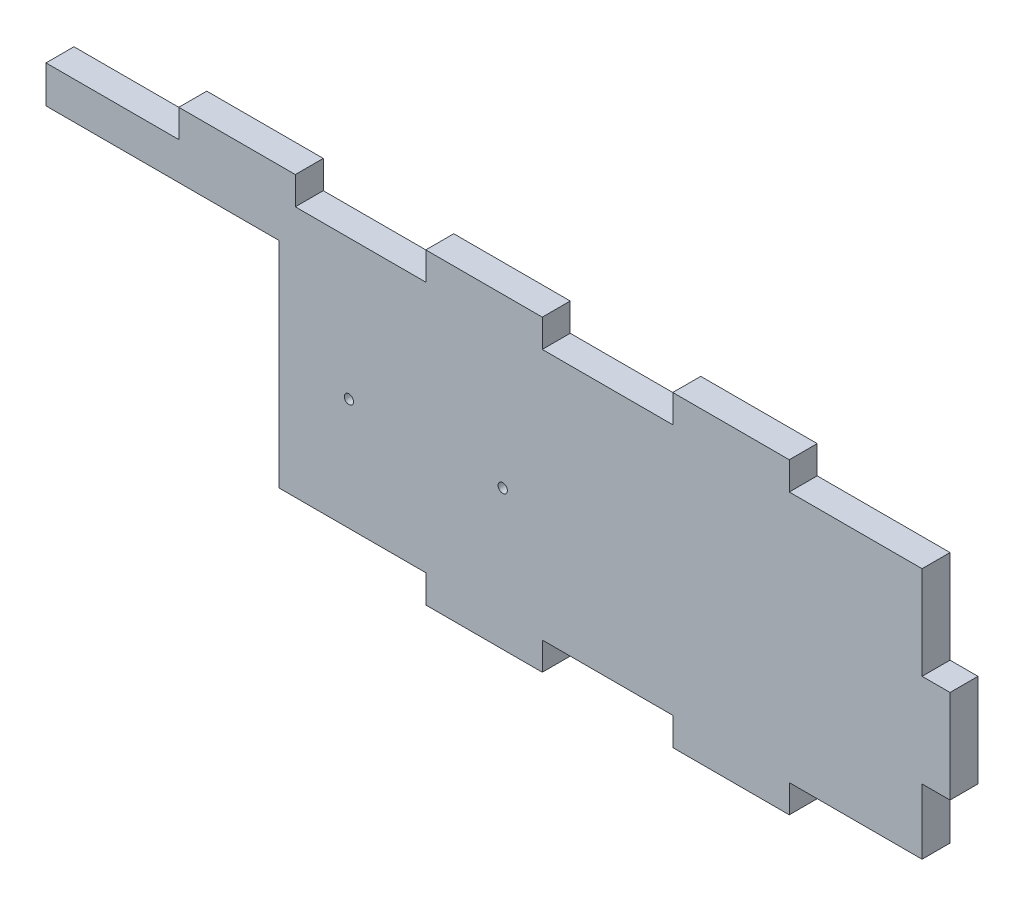
ISO-10303-21;
HEADER;
FILE_DESCRIPTION(('STEP AP214'),'2;1');
FILE_NAME('part.step','',(''),(''),'','','');
FILE_SCHEMA(('AUTOMOTIVE_DESIGN { 1 0 10303 214 1 1 1 1 }'));
ENDSEC;
DATA;
#1=APPLICATION_CONTEXT('core data for automotive mechanical design processes');
#2=APPLICATION_PROTOCOL_DEFINITION('international standard','automotive_design',2000,#1);
#3=PRODUCT_CONTEXT('',#1,'mechanical');
#4=PRODUCT('Part','Part','',(#3));
#5=PRODUCT_RELATED_PRODUCT_CATEGORY('part','',(#4));
#6=PRODUCT_DEFINITION_FORMATION('','',#4);
#7=PRODUCT_DEFINITION_CONTEXT('part definition',#1,'design');
#8=PRODUCT_DEFINITION('design','',#6,#7);
#9=PRODUCT_DEFINITION_SHAPE('','',#8);
#10=(LENGTH_UNIT() NAMED_UNIT(*) SI_UNIT(.MILLI.,.METRE.));
#11=(NAMED_UNIT(*) PLANE_ANGLE_UNIT() SI_UNIT($,.RADIAN.));
#12=(NAMED_UNIT(*) SI_UNIT($,.STERADIAN.) SOLID_ANGLE_UNIT());
#13=UNCERTAINTY_MEASURE_WITH_UNIT(LENGTH_MEASURE(1.E-05),#10,'distance_accuracy_value','');
#14=(GEOMETRIC_REPRESENTATION_CONTEXT(3) GLOBAL_UNCERTAINTY_ASSIGNED_CONTEXT((#13)) GLOBAL_UNIT_ASSIGNED_CONTEXT((#10,
#11,#12)) REPRESENTATION_CONTEXT('',''));
#15=CARTESIAN_POINT('',(0.,0.,0.));
#16=DIRECTION('',(0.,0.,1.));
#17=DIRECTION('',(1.,0.,0.));
#18=AXIS2_PLACEMENT_3D('',#15,#16,#17);
#19=CARTESIAN_POINT('',(94.,-30.,6.));
#20=DIRECTION('',(0.,1.,0.));
#21=DIRECTION('',(-1.,0.,0.));
#22=AXIS2_PLACEMENT_3D('',#19,#20,#21);
#23=PLANE('',#22);
#24=DIRECTION('',(1.,0.,0.));
#25=VECTOR('',#24,1.);
#26=CARTESIAN_POINT('',(94.,-30.,6.));
#27=LINE('',#26,#25);
#28=CARTESIAN_POINT('',(40.5,-30.,6.));
#29=VERTEX_POINT('',#28);
#30=CARTESIAN_POINT('',(65.5,-30.,6.));
#31=VERTEX_POINT('',#30);
#32=EDGE_CURVE('E504',#29,#31,#27,.T.);
#33=ORIENTED_EDGE('',*,*,#32,.F.);
#34=DIRECTION('',(0.,0.,-1.));
#35=VECTOR('',#34,1.);
#36=CARTESIAN_POINT('',(40.5,-30.,10.));
#37=LINE('',#36,#35);
#38=CARTESIAN_POINT('',(40.5,-30.,0.));
#39=VERTEX_POINT('',#38);
#40=EDGE_CURVE('E522',#29,#39,#37,.T.);
#41=ORIENTED_EDGE('',*,*,#40,.T.);
#42=DIRECTION('',(1.,0.,0.));
#43=VECTOR('',#42,1.);
#44=CARTESIAN_POINT('',(94.,-30.,0.));
#45=LINE('',#44,#43);
#46=CARTESIAN_POINT('',(65.5,-30.,0.));
#47=VERTEX_POINT('',#46);
#48=EDGE_CURVE('E250',#39,#47,#45,.T.);
#49=ORIENTED_EDGE('',*,*,#48,.T.);
#50=DIRECTION('',(0.,0.,-1.));
#51=VECTOR('',#50,1.);
#52=CARTESIAN_POINT('',(65.5,-30.,10.));
#53=LINE('',#52,#51);
#54=EDGE_CURVE('E382',#31,#47,#53,.T.);
#55=ORIENTED_EDGE('',*,*,#54,.F.);
#56=EDGE_LOOP('',(#33,#41,#49,#55));
#57=FACE_BOUND('',#56,.T.);
#58=ADVANCED_FACE('F32',(#57),#23,.F.);
#59=CARTESIAN_POINT('',(94.,30.,6.));
#60=DIRECTION('',(0.,-1.,0.));
#61=DIRECTION('',(1.,0.,0.));
#62=AXIS2_PLACEMENT_3D('',#59,#60,#61);
#63=PLANE('',#62);
#64=DIRECTION('',(0.,0.,-1.));
#65=VECTOR('',#64,1.);
#66=CARTESIAN_POINT('',(-40.5,30.,0.));
#67=LINE('',#66,#65);
#68=CARTESIAN_POINT('',(-40.5,30.,6.));
#69=VERTEX_POINT('',#68);
#70=CARTESIAN_POINT('',(-40.5,30.,0.));
#71=VERTEX_POINT('',#70);
#72=EDGE_CURVE('E403',#69,#71,#67,.T.);
#73=ORIENTED_EDGE('',*,*,#72,.F.);
#74=DIRECTION('',(-1.,0.,0.));
#75=VECTOR('',#74,1.);
#76=CARTESIAN_POINT('',(94.,30.,6.));
#77=LINE('',#76,#75);
#78=CARTESIAN_POINT('',(-12.5,30.,6.));
#79=VERTEX_POINT('',#78);
#80=EDGE_CURVE('E326',#79,#69,#77,.T.);
#81=ORIENTED_EDGE('',*,*,#80,.F.);
#82=DIRECTION('',(0.,0.,1.));
#83=VECTOR('',#82,1.);
#84=CARTESIAN_POINT('',(-12.5,30.,0.));
#85=LINE('',#84,#83);
#86=CARTESIAN_POINT('',(-12.5,30.,0.));
#87=VERTEX_POINT('',#86);
#88=EDGE_CURVE('E435',#87,#79,#85,.T.);
#89=ORIENTED_EDGE('',*,*,#88,.F.);
#90=DIRECTION('',(-1.,0.,0.));
#91=VECTOR('',#90,1.);
#92=CARTESIAN_POINT('',(94.,30.,0.));
#93=LINE('',#92,#91);
#94=EDGE_CURVE('E318',#87,#71,#93,.T.);
#95=ORIENTED_EDGE('',*,*,#94,.T.);
#96=EDGE_LOOP('',(#73,#81,#89,#95));
#97=FACE_BOUND('',#96,.T.);
#98=ADVANCED_FACE('F558',(#97),#63,.F.);
#99=DIRECTION('',(0.,0.,1.));
#100=VECTOR('',#99,1.);
#101=CARTESIAN_POINT('',(-65.5,30.,0.));
#102=LINE('',#101,#100);
#103=CARTESIAN_POINT('',(-65.5,30.,0.));
#104=VERTEX_POINT('',#103);
#105=CARTESIAN_POINT('',(-65.5,30.,6.));
#106=VERTEX_POINT('',#105);
#107=EDGE_CURVE('E408',#104,#106,#102,.T.);
#108=ORIENTED_EDGE('',*,*,#107,.F.);
#109=CARTESIAN_POINT('',(-94.,30.,0.));
#110=VERTEX_POINT('',#109);
#111=EDGE_CURVE('E267',#104,#110,#93,.T.);
#112=ORIENTED_EDGE('',*,*,#111,.T.);
#113=DIRECTION('',(0.,0.,-1.));
#114=VECTOR('',#113,1.);
#115=CARTESIAN_POINT('',(-94.,30.,6.));
#116=LINE('',#115,#114);
#117=CARTESIAN_POINT('',(-94.,30.,6.));
#118=VERTEX_POINT('',#117);
#119=EDGE_CURVE('E322',#118,#110,#116,.T.);
#120=ORIENTED_EDGE('',*,*,#119,.F.);
#121=EDGE_CURVE('E268',#106,#118,#77,.T.);
#122=ORIENTED_EDGE('',*,*,#121,.F.);
#123=EDGE_LOOP('',(#108,#112,#120,#122));
#124=FACE_BOUND('',#123,.T.);
#125=ADVANCED_FACE('F485',(#124),#63,.F.);
#126=DIRECTION('',(0.,0.,-1.));
#127=VECTOR('',#126,1.);
#128=CARTESIAN_POINT('',(12.5,30.,0.));
#129=LINE('',#128,#127);
#130=CARTESIAN_POINT('',(12.5,30.,6.));
#131=VERTEX_POINT('',#130);
#132=CARTESIAN_POINT('',(12.5,30.,0.));
#133=VERTEX_POINT('',#132);
#134=EDGE_CURVE('E430',#131,#133,#129,.T.);
#135=ORIENTED_EDGE('',*,*,#134,.F.);
#136=CARTESIAN_POINT('',(40.5,30.,6.));
#137=VERTEX_POINT('',#136);
#138=EDGE_CURVE('E323',#137,#131,#77,.T.);
#139=ORIENTED_EDGE('',*,*,#138,.F.);
#140=DIRECTION('',(0.,0.,1.));
#141=VECTOR('',#140,1.);
#142=CARTESIAN_POINT('',(40.5,30.,0.));
#143=LINE('',#142,#141);
#144=CARTESIAN_POINT('',(40.5,30.,0.));
#145=VERTEX_POINT('',#144);
#146=EDGE_CURVE('E327',#145,#137,#143,.T.);
#147=ORIENTED_EDGE('',*,*,#146,.F.);
#148=EDGE_CURVE('E316',#145,#133,#93,.T.);
#149=ORIENTED_EDGE('',*,*,#148,.T.);
#150=EDGE_LOOP('',(#135,#139,#147,#149));
#151=FACE_BOUND('',#150,.T.);
#152=ADVANCED_FACE('F582',(#151),#63,.F.);
#153=DIRECTION('',(0.,0.,-1.));
#154=VECTOR('',#153,1.);
#155=CARTESIAN_POINT('',(65.5,30.,0.));
#156=LINE('',#155,#154);
#157=CARTESIAN_POINT('',(65.5,30.,6.));
#158=VERTEX_POINT('',#157);
#159=CARTESIAN_POINT('',(65.5,30.,0.));
#160=VERTEX_POINT('',#159);
#161=EDGE_CURVE('E332',#158,#160,#156,.T.);
#162=ORIENTED_EDGE('',*,*,#161,.F.);
#163=CARTESIAN_POINT('',(94.,30.,6.));
#164=VERTEX_POINT('',#163);
#165=EDGE_CURVE('E319',#164,#158,#77,.T.);
#166=ORIENTED_EDGE('',*,*,#165,.F.);
#167=DIRECTION('',(0.,0.,-1.));
#168=VECTOR('',#167,1.);
#169=CARTESIAN_POINT('',(94.,30.,6.));
#170=LINE('',#169,#168);
#171=CARTESIAN_POINT('',(94.,30.,0.));
#172=VERTEX_POINT('',#171);
#173=EDGE_CURVE('E40',#164,#172,#170,.T.);
#174=ORIENTED_EDGE('',*,*,#173,.T.);
#175=EDGE_CURVE('E313',#172,#160,#93,.T.);
#176=ORIENTED_EDGE('',*,*,#175,.T.);
#177=EDGE_LOOP('',(#162,#166,#174,#176));
#178=FACE_BOUND('',#177,.T.);
#179=ADVANCED_FACE('F564',(#178),#63,.F.);
#180=CARTESIAN_POINT('',(94.,-30.,6.));
#181=DIRECTION('',(-1.,0.,0.));
#182=DIRECTION('',(0.,0.,1.));
#183=AXIS2_PLACEMENT_3D('',#180,#181,#182);
#184=PLANE('',#183);
#185=DIRECTION('',(0.,0.,1.));
#186=VECTOR('',#185,1.);
#187=CARTESIAN_POINT('',(94.,10.,6.));
#188=LINE('',#187,#186);
#189=CARTESIAN_POINT('',(94.,10.,0.));
#190=VERTEX_POINT('',#189);
#191=CARTESIAN_POINT('',(94.,10.,6.));
#192=VERTEX_POINT('',#191);
#193=EDGE_CURVE('E283',#190,#192,#188,.T.);
#194=ORIENTED_EDGE('',*,*,#193,.F.);
#195=DIRECTION('',(0.,1.,0.));
#196=VECTOR('',#195,1.);
#197=CARTESIAN_POINT('',(94.,-30.,0.));
#198=LINE('',#197,#196);
#199=EDGE_CURVE('E249',#190,#172,#198,.T.);
#200=ORIENTED_EDGE('',*,*,#199,.T.);
#201=ORIENTED_EDGE('',*,*,#173,.F.);
#202=DIRECTION('',(0.,1.,0.));
#203=VECTOR('',#202,1.);
#204=CARTESIAN_POINT('',(94.,-30.,6.));
#205=LINE('',#204,#203);
#206=EDGE_CURVE('E272',#192,#164,#205,.T.);
#207=ORIENTED_EDGE('',*,*,#206,.F.);
#208=EDGE_LOOP('',(#194,#200,#201,#207));
#209=FACE_BOUND('',#208,.T.);
#210=ADVANCED_FACE('F575',(#209),#184,.F.);
#211=CARTESIAN_POINT('',(94.,-24.,6.));
#212=VERTEX_POINT('',#211);
#213=CARTESIAN_POINT('',(94.,-9.99999999999999,6.));
#214=VERTEX_POINT('',#213);
#215=EDGE_CURVE('E270',#212,#214,#205,.T.);
#216=ORIENTED_EDGE('',*,*,#215,.F.);
#217=DIRECTION('',(0.,0.,-1.));
#218=VECTOR('',#217,1.);
#219=CARTESIAN_POINT('',(94.,-24.,10.));
#220=LINE('',#219,#218);
#221=CARTESIAN_POINT('',(94.,-24.,0.));
#222=VERTEX_POINT('',#221);
#223=EDGE_CURVE('E374',#212,#222,#220,.T.);
#224=ORIENTED_EDGE('',*,*,#223,.T.);
#225=CARTESIAN_POINT('',(94.,-9.99999999999999,0.));
#226=VERTEX_POINT('',#225);
#227=EDGE_CURVE('E252',#222,#226,#198,.T.);
#228=ORIENTED_EDGE('',*,*,#227,.T.);
#229=DIRECTION('',(0.,0.,-1.));
#230=VECTOR('',#229,1.);
#231=CARTESIAN_POINT('',(94.,-9.99999999999999,6.));
#232=LINE('',#231,#230);
#233=EDGE_CURVE('E279',#214,#226,#232,.T.);
#234=ORIENTED_EDGE('',*,*,#233,.F.);
#235=EDGE_LOOP('',(#216,#224,#228,#234));
#236=FACE_BOUND('',#235,.T.);
#237=ADVANCED_FACE('F372',(#236),#184,.F.);
#238=CARTESIAN_POINT('',(-94.,-30.,6.));
#239=DIRECTION('',(1.,0.,0.));
#240=DIRECTION('',(0.,0.,-1.));
#241=AXIS2_PLACEMENT_3D('',#238,#239,#240);
#242=PLANE('',#241);
#243=DIRECTION('',(0.,-1.,0.));
#244=VECTOR('',#243,1.);
#245=CARTESIAN_POINT('',(-94.,-30.,0.));
#246=LINE('',#245,#244);
#247=CARTESIAN_POINT('',(-94.,22.,0.));
#248=VERTEX_POINT('',#247);
#249=EDGE_CURVE('E254',#110,#248,#246,.T.);
#250=ORIENTED_EDGE('',*,*,#249,.T.);
#251=DIRECTION('',(0.,0.,-1.));
#252=VECTOR('',#251,1.);
#253=CARTESIAN_POINT('',(-94.,22.,10.));
#254=LINE('',#253,#252);
#255=CARTESIAN_POINT('',(-94.,22.,6.));
#256=VERTEX_POINT('',#255);
#257=EDGE_CURVE('E718',#256,#248,#254,.T.);
#258=ORIENTED_EDGE('',*,*,#257,.F.);
#259=DIRECTION('',(0.,-1.,0.));
#260=VECTOR('',#259,1.);
#261=CARTESIAN_POINT('',(-94.,-30.,6.));
#262=LINE('',#261,#260);
#263=EDGE_CURVE('E315',#118,#256,#262,.T.);
#264=ORIENTED_EDGE('',*,*,#263,.F.);
#265=ORIENTED_EDGE('',*,*,#119,.T.);
#266=EDGE_LOOP('',(#250,#258,#264,#265));
#267=FACE_BOUND('',#266,.T.);
#268=ADVANCED_FACE('F34',(#267),#242,.F.);
#269=CARTESIAN_POINT('',(-12.5,-30.,6.));
#270=VERTEX_POINT('',#269);
#271=CARTESIAN_POINT('',(12.5,-30.,6.));
#272=VERTEX_POINT('',#271);
#273=EDGE_CURVE('E242',#270,#272,#27,.T.);
#274=ORIENTED_EDGE('',*,*,#273,.F.);
#275=DIRECTION('',(0.,0.,-1.));
#276=VECTOR('',#275,1.);
#277=CARTESIAN_POINT('',(-12.5,-30.,10.));
#278=LINE('',#277,#276);
#279=CARTESIAN_POINT('',(-12.5,-30.,0.));
#280=VERTEX_POINT('',#279);
#281=EDGE_CURVE('E232',#270,#280,#278,.T.);
#282=ORIENTED_EDGE('',*,*,#281,.T.);
#283=CARTESIAN_POINT('',(12.5,-30.,0.));
#284=VERTEX_POINT('',#283);
#285=EDGE_CURVE('E54',#280,#284,#45,.T.);
#286=ORIENTED_EDGE('',*,*,#285,.T.);
#287=DIRECTION('',(0.,0.,-1.));
#288=VECTOR('',#287,1.);
#289=CARTESIAN_POINT('',(12.5,-30.,10.));
#290=LINE('',#289,#288);
#291=EDGE_CURVE('E517',#272,#284,#290,.T.);
#292=ORIENTED_EDGE('',*,*,#291,.F.);
#293=EDGE_LOOP('',(#274,#282,#286,#292));
#294=FACE_BOUND('',#293,.T.);
#295=ADVANCED_FACE('F241',(#294),#23,.F.);
#296=CARTESIAN_POINT('',(0.,0.,6.));
#297=DIRECTION('',(0.,0.,1.));
#298=DIRECTION('',(1.,0.,0.));
#299=AXIS2_PLACEMENT_3D('',#296,#297,#298);
#300=PLANE('',#299);
#301=DIRECTION('',(0.,1.,0.));
#302=VECTOR('',#301,1.);
#303=CARTESIAN_POINT('',(-12.5,0.,6.));
#304=LINE('',#303,#302);
#305=CARTESIAN_POINT('',(-12.5,-24.,6.));
#306=VERTEX_POINT('',#305);
#307=EDGE_CURVE('E513',#270,#306,#304,.T.);
#308=ORIENTED_EDGE('',*,*,#307,.F.);
#309=ORIENTED_EDGE('',*,*,#273,.T.);
#310=DIRECTION('',(0.,-1.,0.));
#311=VECTOR('',#310,1.);
#312=CARTESIAN_POINT('',(12.5,0.,6.));
#313=LINE('',#312,#311);
#314=CARTESIAN_POINT('',(12.5,-24.,6.));
#315=VERTEX_POINT('',#314);
#316=EDGE_CURVE('E512',#315,#272,#313,.T.);
#317=ORIENTED_EDGE('',*,*,#316,.F.);
#318=DIRECTION('',(-1.,0.,0.));
#319=VECTOR('',#318,1.);
#320=CARTESIAN_POINT('',(0.,-24.,6.));
#321=LINE('',#320,#319);
#322=CARTESIAN_POINT('',(40.5,-24.,6.));
#323=VERTEX_POINT('',#322);
#324=EDGE_CURVE('E519',#323,#315,#321,.T.);
#325=ORIENTED_EDGE('',*,*,#324,.F.);
#326=DIRECTION('',(0.,1.,0.));
#327=VECTOR('',#326,1.);
#328=CARTESIAN_POINT('',(40.4999999999999,0.,6.));
#329=LINE('',#328,#327);
#330=EDGE_CURVE('E531',#29,#323,#329,.T.);
#331=ORIENTED_EDGE('',*,*,#330,.F.);
#332=ORIENTED_EDGE('',*,*,#32,.T.);
#333=DIRECTION('',(0.,-1.,0.));
#334=VECTOR('',#333,1.);
#335=CARTESIAN_POINT('',(65.5,0.,6.));
#336=LINE('',#335,#334);
#337=CARTESIAN_POINT('',(65.5,-24.,6.));
#338=VERTEX_POINT('',#337);
#339=EDGE_CURVE('E376',#338,#31,#336,.T.);
#340=ORIENTED_EDGE('',*,*,#339,.F.);
#341=DIRECTION('',(-1.,0.,0.));
#342=VECTOR('',#341,1.);
#343=CARTESIAN_POINT('',(0.,-24.,6.));
#344=LINE('',#343,#342);
#345=EDGE_CURVE('E380',#212,#338,#344,.T.);
#346=ORIENTED_EDGE('',*,*,#345,.F.);
#347=ORIENTED_EDGE('',*,*,#215,.T.);
#348=DIRECTION('',(-1.,0.,0.));
#349=VECTOR('',#348,1.);
#350=CARTESIAN_POINT('',(100.,-9.99999999999999,6.));
#351=LINE('',#350,#349);
#352=CARTESIAN_POINT('',(100.,-9.99999999999999,6.));
#353=VERTEX_POINT('',#352);
#354=EDGE_CURVE('E358',#353,#214,#351,.T.);
#355=ORIENTED_EDGE('',*,*,#354,.F.);
#356=DIRECTION('',(0.,-1.,0.));
#357=VECTOR('',#356,1.);
#358=CARTESIAN_POINT('',(100.,10.,6.));
#359=LINE('',#358,#357);
#360=CARTESIAN_POINT('',(100.,10.,6.));
#361=VERTEX_POINT('',#360);
#362=EDGE_CURVE('E300',#361,#353,#359,.T.);
#363=ORIENTED_EDGE('',*,*,#362,.F.);
#364=DIRECTION('',(-1.,0.,0.));
#365=VECTOR('',#364,1.);
#366=CARTESIAN_POINT('',(100.,10.,6.));
#367=LINE('',#366,#365);
#368=EDGE_CURVE('E303',#361,#192,#367,.T.);
#369=ORIENTED_EDGE('',*,*,#368,.T.);
#370=ORIENTED_EDGE('',*,*,#206,.T.);
#371=ORIENTED_EDGE('',*,*,#165,.T.);
#372=DIRECTION('',(0.,-1.,0.));
#373=VECTOR('',#372,1.);
#374=CARTESIAN_POINT('',(65.5,36.,6.));
#375=LINE('',#374,#373);
#376=CARTESIAN_POINT('',(65.5,36.,6.));
#377=VERTEX_POINT('',#376);
#378=EDGE_CURVE('E463',#377,#158,#375,.T.);
#379=ORIENTED_EDGE('',*,*,#378,.F.);
#380=DIRECTION('',(1.,0.,0.));
#381=VECTOR('',#380,1.);
#382=CARTESIAN_POINT('',(65.5,36.,6.));
#383=LINE('',#382,#381);
#384=CARTESIAN_POINT('',(40.5,36.,6.));
#385=VERTEX_POINT('',#384);
#386=EDGE_CURVE('E462',#385,#377,#383,.T.);
#387=ORIENTED_EDGE('',*,*,#386,.F.);
#388=DIRECTION('',(0.,-1.,0.));
#389=VECTOR('',#388,1.);
#390=CARTESIAN_POINT('',(40.5,36.,6.));
#391=LINE('',#390,#389);
#392=EDGE_CURVE('E333',#385,#137,#391,.T.);
#393=ORIENTED_EDGE('',*,*,#392,.T.);
#394=ORIENTED_EDGE('',*,*,#138,.T.);
#395=DIRECTION('',(0.,-1.,0.));
#396=VECTOR('',#395,1.);
#397=CARTESIAN_POINT('',(12.5,36.,6.));
#398=LINE('',#397,#396);
#399=CARTESIAN_POINT('',(12.5,36.,6.));
#400=VERTEX_POINT('',#399);
#401=EDGE_CURVE('E441',#400,#131,#398,.T.);
#402=ORIENTED_EDGE('',*,*,#401,.F.);
#403=DIRECTION('',(1.,0.,0.));
#404=VECTOR('',#403,1.);
#405=CARTESIAN_POINT('',(12.5,36.,6.));
#406=LINE('',#405,#404);
#407=CARTESIAN_POINT('',(-12.5,36.,6.));
#408=VERTEX_POINT('',#407);
#409=EDGE_CURVE('E439',#408,#400,#406,.T.);
#410=ORIENTED_EDGE('',*,*,#409,.F.);
#411=DIRECTION('',(0.,-1.,0.));
#412=VECTOR('',#411,1.);
#413=CARTESIAN_POINT('',(-12.5,36.,6.));
#414=LINE('',#413,#412);
#415=EDGE_CURVE('E448',#408,#79,#414,.T.);
#416=ORIENTED_EDGE('',*,*,#415,.T.);
#417=ORIENTED_EDGE('',*,*,#80,.T.);
#418=DIRECTION('',(0.,-1.,0.));
#419=VECTOR('',#418,1.);
#420=CARTESIAN_POINT('',(-40.5,36.,6.));
#421=LINE('',#420,#419);
#422=CARTESIAN_POINT('',(-40.5,36.,6.));
#423=VERTEX_POINT('',#422);
#424=EDGE_CURVE('E414',#423,#69,#421,.T.);
#425=ORIENTED_EDGE('',*,*,#424,.F.);
#426=DIRECTION('',(1.,0.,0.));
#427=VECTOR('',#426,1.);
#428=CARTESIAN_POINT('',(-40.5,36.,6.));
#429=LINE('',#428,#427);
#430=CARTESIAN_POINT('',(-65.5,36.,6.));
#431=VERTEX_POINT('',#430);
#432=EDGE_CURVE('E412',#431,#423,#429,.T.);
#433=ORIENTED_EDGE('',*,*,#432,.F.);
#434=DIRECTION('',(0.,-1.,0.));
#435=VECTOR('',#434,1.);
#436=CARTESIAN_POINT('',(-65.5,36.,6.));
#437=LINE('',#436,#435);
#438=EDGE_CURVE('E421',#431,#106,#437,.T.);
#439=ORIENTED_EDGE('',*,*,#438,.T.);
#440=ORIENTED_EDGE('',*,*,#121,.T.);
#441=ORIENTED_EDGE('',*,*,#263,.T.);
#442=DIRECTION('',(-1.,0.,0.));
#443=VECTOR('',#442,1.);
#444=CARTESIAN_POINT('',(0.,22.,6.));
#445=LINE('',#444,#443);
#446=CARTESIAN_POINT('',(-44.,22.,6.));
#447=VERTEX_POINT('',#446);
#448=EDGE_CURVE('E496',#447,#256,#445,.T.);
#449=ORIENTED_EDGE('',*,*,#448,.F.);
#450=DIRECTION('',(0.,1.,0.));
#451=VECTOR('',#450,1.);
#452=CARTESIAN_POINT('',(-44.,0.,6.));
#453=LINE('',#452,#451);
#454=CARTESIAN_POINT('',(-44.,-24.,6.));
#455=VERTEX_POINT('',#454);
#456=EDGE_CURVE('E495',#455,#447,#453,.T.);
#457=ORIENTED_EDGE('',*,*,#456,.F.);
#458=DIRECTION('',(-1.,0.,0.));
#459=VECTOR('',#458,1.);
#460=CARTESIAN_POINT('',(0.,-24.,6.));
#461=LINE('',#460,#459);
#462=EDGE_CURVE('E47',#306,#455,#461,.T.);
#463=ORIENTED_EDGE('',*,*,#462,.F.);
#464=EDGE_LOOP('',(#308,#309,#317,#325,#331,#332,#340,#346,#347,#355,#363,#369,#370,#371,#379,
#387,#393,#394,#402,#410,#416,#417,#425,#433,#439,#440,#441,#449,#457,#463));
#465=FACE_BOUND('',#464,.T.);
#466=CARTESIAN_POINT('',(4.,0.,6.));
#467=DIRECTION('',(0.,0.,1.));
#468=DIRECTION('',(1.,0.,0.));
#469=AXIS2_PLACEMENT_3D('',#466,#467,#468);
#470=CIRCLE('',#469,1.);
#471=CARTESIAN_POINT('',(5.00000000000001,0.,6.));
#472=VERTEX_POINT('',#471);
#473=EDGE_CURVE('E394',#472,#472,#470,.T.);
#474=ORIENTED_EDGE('',*,*,#473,.F.);
#475=EDGE_LOOP('',(#474));
#476=FACE_BOUND('',#475,.T.);
#477=CARTESIAN_POINT('',(-29.,0.,6.));
#478=DIRECTION('',(0.,0.,1.));
#479=DIRECTION('',(1.,0.,0.));
#480=AXIS2_PLACEMENT_3D('',#477,#478,#479);
#481=CIRCLE('',#480,1.);
#482=CARTESIAN_POINT('',(-28.,0.,6.));
#483=VERTEX_POINT('',#482);
#484=EDGE_CURVE('E400',#483,#483,#481,.T.);
#485=ORIENTED_EDGE('',*,*,#484,.F.);
#486=EDGE_LOOP('',(#485));
#487=FACE_BOUND('',#486,.T.);
#488=ADVANCED_FACE('F355',(#465,#476,#487),#300,.T.);
#489=CARTESIAN_POINT('',(0.,0.,0.));
#490=DIRECTION('',(0.,0.,1.));
#491=DIRECTION('',(1.,0.,0.));
#492=AXIS2_PLACEMENT_3D('',#489,#490,#491);
#493=PLANE('',#492);
#494=CARTESIAN_POINT('',(4.,0.,0.));
#495=DIRECTION('',(0.,0.,-1.));
#496=DIRECTION('',(-1.,0.,0.));
#497=AXIS2_PLACEMENT_3D('',#494,#495,#496);
#498=CIRCLE('',#497,1.);
#499=CARTESIAN_POINT('',(3.,0.,0.));
#500=VERTEX_POINT('',#499);
#501=EDGE_CURVE('E391',#500,#500,#498,.T.);
#502=ORIENTED_EDGE('',*,*,#501,.F.);
#503=EDGE_LOOP('',(#502));
#504=FACE_BOUND('',#503,.T.);
#505=CARTESIAN_POINT('',(-29.,0.,0.));
#506=DIRECTION('',(0.,0.,-1.));
#507=DIRECTION('',(-1.,0.,0.));
#508=AXIS2_PLACEMENT_3D('',#505,#506,#507);
#509=CIRCLE('',#508,1.);
#510=CARTESIAN_POINT('',(-30.,0.,0.));
#511=VERTEX_POINT('',#510);
#512=EDGE_CURVE('E397',#511,#511,#509,.T.);
#513=ORIENTED_EDGE('',*,*,#512,.F.);
#514=EDGE_LOOP('',(#513));
#515=FACE_BOUND('',#514,.T.);
#516=ORIENTED_EDGE('',*,*,#285,.F.);
#517=DIRECTION('',(0.,-1.,0.));
#518=VECTOR('',#517,1.);
#519=CARTESIAN_POINT('',(-12.5,-30.,0.));
#520=LINE('',#519,#518);
#521=CARTESIAN_POINT('',(-12.5,-24.,0.));
#522=VERTEX_POINT('',#521);
#523=EDGE_CURVE('E230',#522,#280,#520,.T.);
#524=ORIENTED_EDGE('',*,*,#523,.F.);
#525=DIRECTION('',(1.,0.,0.));
#526=VECTOR('',#525,1.);
#527=CARTESIAN_POINT('',(-12.5,-24.,0.));
#528=LINE('',#527,#526);
#529=CARTESIAN_POINT('',(-44.,-24.,0.));
#530=VERTEX_POINT('',#529);
#531=EDGE_CURVE('E238',#530,#522,#528,.T.);
#532=ORIENTED_EDGE('',*,*,#531,.F.);
#533=DIRECTION('',(0.,-1.,0.));
#534=VECTOR('',#533,1.);
#535=CARTESIAN_POINT('',(-44.,-30.,0.));
#536=LINE('',#535,#534);
#537=CARTESIAN_POINT('',(-44.,22.,0.));
#538=VERTEX_POINT('',#537);
#539=EDGE_CURVE('E364',#538,#530,#536,.T.);
#540=ORIENTED_EDGE('',*,*,#539,.F.);
#541=DIRECTION('',(1.,0.,0.));
#542=VECTOR('',#541,1.);
#543=CARTESIAN_POINT('',(-94.,22.,0.));
#544=LINE('',#543,#542);
#545=EDGE_CURVE('E294',#248,#538,#544,.T.);
#546=ORIENTED_EDGE('',*,*,#545,.F.);
#547=ORIENTED_EDGE('',*,*,#249,.F.);
#548=ORIENTED_EDGE('',*,*,#111,.F.);
#549=DIRECTION('',(0.,-1.,0.));
#550=VECTOR('',#549,1.);
#551=CARTESIAN_POINT('',(-65.5,36.,0.));
#552=LINE('',#551,#550);
#553=CARTESIAN_POINT('',(-65.5,36.,0.));
#554=VERTEX_POINT('',#553);
#555=EDGE_CURVE('E424',#554,#104,#552,.T.);
#556=ORIENTED_EDGE('',*,*,#555,.F.);
#557=DIRECTION('',(-1.,0.,0.));
#558=VECTOR('',#557,1.);
#559=CARTESIAN_POINT('',(-40.5,36.,0.));
#560=LINE('',#559,#558);
#561=CARTESIAN_POINT('',(-40.5,36.,0.));
#562=VERTEX_POINT('',#561);
#563=EDGE_CURVE('E407',#562,#554,#560,.T.);
#564=ORIENTED_EDGE('',*,*,#563,.F.);
#565=DIRECTION('',(0.,-1.,0.));
#566=VECTOR('',#565,1.);
#567=CARTESIAN_POINT('',(-40.5,36.,0.));
#568=LINE('',#567,#566);
#569=EDGE_CURVE('E427',#562,#71,#568,.T.);
#570=ORIENTED_EDGE('',*,*,#569,.T.);
#571=ORIENTED_EDGE('',*,*,#94,.F.);
#572=DIRECTION('',(0.,-1.,0.));
#573=VECTOR('',#572,1.);
#574=CARTESIAN_POINT('',(-12.5,36.,0.));
#575=LINE('',#574,#573);
#576=CARTESIAN_POINT('',(-12.5,36.,0.));
#577=VERTEX_POINT('',#576);
#578=EDGE_CURVE('E451',#577,#87,#575,.T.);
#579=ORIENTED_EDGE('',*,*,#578,.F.);
#580=DIRECTION('',(-1.,0.,0.));
#581=VECTOR('',#580,1.);
#582=CARTESIAN_POINT('',(12.5,36.,0.));
#583=LINE('',#582,#581);
#584=CARTESIAN_POINT('',(12.5,36.,0.));
#585=VERTEX_POINT('',#584);
#586=EDGE_CURVE('E434',#585,#577,#583,.T.);
#587=ORIENTED_EDGE('',*,*,#586,.F.);
#588=DIRECTION('',(0.,-1.,0.));
#589=VECTOR('',#588,1.);
#590=CARTESIAN_POINT('',(12.5,36.,0.));
#591=LINE('',#590,#589);
#592=EDGE_CURVE('E454',#585,#133,#591,.T.);
#593=ORIENTED_EDGE('',*,*,#592,.T.);
#594=ORIENTED_EDGE('',*,*,#148,.F.);
#595=DIRECTION('',(0.,-1.,0.));
#596=VECTOR('',#595,1.);
#597=CARTESIAN_POINT('',(40.5,36.,0.));
#598=LINE('',#597,#596);
#599=CARTESIAN_POINT('',(40.5,36.,0.));
#600=VERTEX_POINT('',#599);
#601=EDGE_CURVE('E473',#600,#145,#598,.T.);
#602=ORIENTED_EDGE('',*,*,#601,.F.);
#603=DIRECTION('',(-1.,0.,0.));
#604=VECTOR('',#603,1.);
#605=CARTESIAN_POINT('',(65.5,36.,0.));
#606=LINE('',#605,#604);
#607=CARTESIAN_POINT('',(65.5,36.,0.));
#608=VERTEX_POINT('',#607);
#609=EDGE_CURVE('E459',#608,#600,#606,.T.);
#610=ORIENTED_EDGE('',*,*,#609,.F.);
#611=DIRECTION('',(0.,-1.,0.));
#612=VECTOR('',#611,1.);
#613=CARTESIAN_POINT('',(65.5,36.,0.));
#614=LINE('',#613,#612);
#615=EDGE_CURVE('E284',#608,#160,#614,.T.);
#616=ORIENTED_EDGE('',*,*,#615,.T.);
#617=ORIENTED_EDGE('',*,*,#175,.F.);
#618=ORIENTED_EDGE('',*,*,#199,.F.);
#619=DIRECTION('',(-1.,0.,0.));
#620=VECTOR('',#619,1.);
#621=CARTESIAN_POINT('',(100.,10.,0.));
#622=LINE('',#621,#620);
#623=CARTESIAN_POINT('',(100.,10.,0.));
#624=VERTEX_POINT('',#623);
#625=EDGE_CURVE('E306',#624,#190,#622,.T.);
#626=ORIENTED_EDGE('',*,*,#625,.F.);
#627=DIRECTION('',(0.,1.,0.));
#628=VECTOR('',#627,1.);
#629=CARTESIAN_POINT('',(100.,10.,0.));
#630=LINE('',#629,#628);
#631=CARTESIAN_POINT('',(100.,-9.99999999999999,0.));
#632=VERTEX_POINT('',#631);
#633=EDGE_CURVE('E343',#632,#624,#630,.T.);
#634=ORIENTED_EDGE('',*,*,#633,.F.);
#635=DIRECTION('',(-1.,0.,0.));
#636=VECTOR('',#635,1.);
#637=CARTESIAN_POINT('',(100.,-9.99999999999999,0.));
#638=LINE('',#637,#636);
#639=EDGE_CURVE('E285',#632,#226,#638,.T.);
#640=ORIENTED_EDGE('',*,*,#639,.T.);
#641=ORIENTED_EDGE('',*,*,#227,.F.);
#642=DIRECTION('',(1.,0.,0.));
#643=VECTOR('',#642,1.);
#644=CARTESIAN_POINT('',(94.,-24.,0.));
#645=LINE('',#644,#643);
#646=CARTESIAN_POINT('',(65.5,-24.,0.));
#647=VERTEX_POINT('',#646);
#648=EDGE_CURVE('E385',#647,#222,#645,.T.);
#649=ORIENTED_EDGE('',*,*,#648,.F.);
#650=DIRECTION('',(0.,1.,0.));
#651=VECTOR('',#650,1.);
#652=CARTESIAN_POINT('',(65.5,-30.,0.));
#653=LINE('',#652,#651);
#654=EDGE_CURVE('E532',#47,#647,#653,.T.);
#655=ORIENTED_EDGE('',*,*,#654,.F.);
#656=ORIENTED_EDGE('',*,*,#48,.F.);
#657=DIRECTION('',(0.,-1.,0.));
#658=VECTOR('',#657,1.);
#659=CARTESIAN_POINT('',(40.5,-30.,0.));
#660=LINE('',#659,#658);
#661=CARTESIAN_POINT('',(40.5,-24.,0.));
#662=VERTEX_POINT('',#661);
#663=EDGE_CURVE('E540',#662,#39,#660,.T.);
#664=ORIENTED_EDGE('',*,*,#663,.F.);
#665=DIRECTION('',(1.,0.,0.));
#666=VECTOR('',#665,1.);
#667=CARTESIAN_POINT('',(40.5,-24.,0.));
#668=LINE('',#667,#666);
#669=CARTESIAN_POINT('',(12.5,-24.,0.));
#670=VERTEX_POINT('',#669);
#671=EDGE_CURVE('E526',#670,#662,#668,.T.);
#672=ORIENTED_EDGE('',*,*,#671,.F.);
#673=DIRECTION('',(0.,1.,0.));
#674=VECTOR('',#673,1.);
#675=CARTESIAN_POINT('',(12.5,-30.,0.));
#676=LINE('',#675,#674);
#677=EDGE_CURVE('E248',#284,#670,#676,.T.);
#678=ORIENTED_EDGE('',*,*,#677,.F.);
#679=EDGE_LOOP('',(#516,#524,#532,#540,#546,#547,#548,#556,#564,#570,#571,#579,#587,#593,#594,
#602,#610,#616,#617,#618,#626,#634,#640,#641,#649,#655,#656,#664,#672,#678));
#680=FACE_BOUND('',#679,.T.);
#681=ADVANCED_FACE('F245',(#504,#515,#680),#493,.F.);
#682=CARTESIAN_POINT('',(-44.,-30.,10.));
#683=DIRECTION('',(1.,0.,0.));
#684=DIRECTION('',(0.,0.,-1.));
#685=AXIS2_PLACEMENT_3D('',#682,#683,#684);
#686=PLANE('',#685);
#687=ORIENTED_EDGE('',*,*,#539,.T.);
#688=DIRECTION('',(0.,0.,1.));
#689=VECTOR('',#688,1.);
#690=CARTESIAN_POINT('',(-44.,-24.,10.));
#691=LINE('',#690,#689);
#692=EDGE_CURVE('E11',#530,#455,#691,.T.);
#693=ORIENTED_EDGE('',*,*,#692,.T.);
#694=ORIENTED_EDGE('',*,*,#456,.T.);
#695=DIRECTION('',(0.,0.,-1.));
#696=VECTOR('',#695,1.);
#697=CARTESIAN_POINT('',(-44.,22.,10.));
#698=LINE('',#697,#696);
#699=EDGE_CURVE('E501',#447,#538,#698,.T.);
#700=ORIENTED_EDGE('',*,*,#699,.T.);
#701=EDGE_LOOP('',(#687,#693,#694,#700));
#702=FACE_BOUND('',#701,.T.);
#703=ADVANCED_FACE('F585',(#702),#686,.F.);
#704=CARTESIAN_POINT('',(-94.,22.,10.));
#705=DIRECTION('',(0.,1.,0.));
#706=DIRECTION('',(-1.,0.,0.));
#707=AXIS2_PLACEMENT_3D('',#704,#705,#706);
#708=PLANE('',#707);
#709=ORIENTED_EDGE('',*,*,#448,.T.);
#710=ORIENTED_EDGE('',*,*,#257,.T.);
#711=ORIENTED_EDGE('',*,*,#545,.T.);
#712=ORIENTED_EDGE('',*,*,#699,.F.);
#713=EDGE_LOOP('',(#709,#710,#711,#712));
#714=FACE_BOUND('',#713,.T.);
#715=ADVANCED_FACE('F588',(#714),#708,.F.);
#716=CARTESIAN_POINT('',(100.,-9.99999999999999,6.));
#717=DIRECTION('',(0.,1.,0.));
#718=DIRECTION('',(0.,0.,1.));
#719=AXIS2_PLACEMENT_3D('',#716,#717,#718);
#720=PLANE('',#719);
#721=ORIENTED_EDGE('',*,*,#233,.T.);
#722=ORIENTED_EDGE('',*,*,#639,.F.);
#723=DIRECTION('',(0.,0.,-1.));
#724=VECTOR('',#723,1.);
#725=CARTESIAN_POINT('',(100.,-9.99999999999999,6.));
#726=LINE('',#725,#724);
#727=EDGE_CURVE('E342',#353,#632,#726,.T.);
#728=ORIENTED_EDGE('',*,*,#727,.F.);
#729=ORIENTED_EDGE('',*,*,#354,.T.);
#730=EDGE_LOOP('',(#721,#722,#728,#729));
#731=FACE_BOUND('',#730,.T.);
#732=ADVANCED_FACE('F370',(#731),#720,.F.);
#733=CARTESIAN_POINT('',(100.,10.,6.));
#734=DIRECTION('',(0.,-1.,0.));
#735=DIRECTION('',(0.,0.,-1.));
#736=AXIS2_PLACEMENT_3D('',#733,#734,#735);
#737=PLANE('',#736);
#738=ORIENTED_EDGE('',*,*,#193,.T.);
#739=ORIENTED_EDGE('',*,*,#368,.F.);
#740=DIRECTION('',(0.,0.,1.));
#741=VECTOR('',#740,1.);
#742=CARTESIAN_POINT('',(100.,10.,6.));
#743=LINE('',#742,#741);
#744=EDGE_CURVE('E290',#624,#361,#743,.T.);
#745=ORIENTED_EDGE('',*,*,#744,.F.);
#746=ORIENTED_EDGE('',*,*,#625,.T.);
#747=EDGE_LOOP('',(#738,#739,#745,#746));
#748=FACE_BOUND('',#747,.T.);
#749=ADVANCED_FACE('F353',(#748),#737,.F.);
#750=CARTESIAN_POINT('',(100.,0.,0.));
#751=DIRECTION('',(1.,0.,0.));
#752=DIRECTION('',(0.,0.,-1.));
#753=AXIS2_PLACEMENT_3D('',#750,#751,#752);
#754=PLANE('',#753);
#755=ORIENTED_EDGE('',*,*,#362,.T.);
#756=ORIENTED_EDGE('',*,*,#727,.T.);
#757=ORIENTED_EDGE('',*,*,#633,.T.);
#758=ORIENTED_EDGE('',*,*,#744,.T.);
#759=EDGE_LOOP('',(#755,#756,#757,#758));
#760=FACE_BOUND('',#759,.T.);
#761=ADVANCED_FACE('F349',(#760),#754,.T.);
#762=CARTESIAN_POINT('',(65.5,36.,0.));
#763=DIRECTION('',(-1.,0.,0.));
#764=DIRECTION('',(0.,-1.,0.));
#765=AXIS2_PLACEMENT_3D('',#762,#763,#764);
#766=PLANE('',#765);
#767=ORIENTED_EDGE('',*,*,#161,.T.);
#768=ORIENTED_EDGE('',*,*,#615,.F.);
#769=DIRECTION('',(0.,0.,-1.));
#770=VECTOR('',#769,1.);
#771=CARTESIAN_POINT('',(65.5,36.,0.));
#772=LINE('',#771,#770);
#773=EDGE_CURVE('E331',#377,#608,#772,.T.);
#774=ORIENTED_EDGE('',*,*,#773,.F.);
#775=ORIENTED_EDGE('',*,*,#378,.T.);
#776=EDGE_LOOP('',(#767,#768,#774,#775));
#777=FACE_BOUND('',#776,.T.);
#778=ADVANCED_FACE('F600',(#777),#766,.F.);
#779=CARTESIAN_POINT('',(40.5,36.,0.));
#780=DIRECTION('',(1.,0.,0.));
#781=DIRECTION('',(0.,0.,-1.));
#782=AXIS2_PLACEMENT_3D('',#779,#780,#781);
#783=PLANE('',#782);
#784=ORIENTED_EDGE('',*,*,#146,.T.);
#785=ORIENTED_EDGE('',*,*,#392,.F.);
#786=DIRECTION('',(0.,0.,1.));
#787=VECTOR('',#786,1.);
#788=CARTESIAN_POINT('',(40.5,36.,0.));
#789=LINE('',#788,#787);
#790=EDGE_CURVE('E461',#600,#385,#789,.T.);
#791=ORIENTED_EDGE('',*,*,#790,.F.);
#792=ORIENTED_EDGE('',*,*,#601,.T.);
#793=EDGE_LOOP('',(#784,#785,#791,#792));
#794=FACE_BOUND('',#793,.T.);
#795=ADVANCED_FACE('F603',(#794),#783,.F.);
#796=CARTESIAN_POINT('',(0.,36.,0.));
#797=DIRECTION('',(0.,-1.,0.));
#798=DIRECTION('',(1.,0.,0.));
#799=AXIS2_PLACEMENT_3D('',#796,#797,#798);
#800=PLANE('',#799);
#801=ORIENTED_EDGE('',*,*,#773,.T.);
#802=ORIENTED_EDGE('',*,*,#609,.T.);
#803=ORIENTED_EDGE('',*,*,#790,.T.);
#804=ORIENTED_EDGE('',*,*,#386,.T.);
#805=EDGE_LOOP('',(#801,#802,#803,#804));
#806=FACE_BOUND('',#805,.T.);
#807=ADVANCED_FACE('F606',(#806),#800,.F.);
#808=CARTESIAN_POINT('',(12.5,36.,0.));
#809=DIRECTION('',(-1.,0.,0.));
#810=DIRECTION('',(0.,0.,1.));
#811=AXIS2_PLACEMENT_3D('',#808,#809,#810);
#812=PLANE('',#811);
#813=ORIENTED_EDGE('',*,*,#134,.T.);
#814=ORIENTED_EDGE('',*,*,#592,.F.);
#815=DIRECTION('',(0.,0.,-1.));
#816=VECTOR('',#815,1.);
#817=CARTESIAN_POINT('',(12.5,36.,0.));
#818=LINE('',#817,#816);
#819=EDGE_CURVE('E431',#400,#585,#818,.T.);
#820=ORIENTED_EDGE('',*,*,#819,.F.);
#821=ORIENTED_EDGE('',*,*,#401,.T.);
#822=EDGE_LOOP('',(#813,#814,#820,#821));
#823=FACE_BOUND('',#822,.T.);
#824=ADVANCED_FACE('F610',(#823),#812,.F.);
#825=CARTESIAN_POINT('',(-12.5,36.,0.));
#826=DIRECTION('',(1.,0.,0.));
#827=DIRECTION('',(0.,0.,-1.));
#828=AXIS2_PLACEMENT_3D('',#825,#826,#827);
#829=PLANE('',#828);
#830=ORIENTED_EDGE('',*,*,#88,.T.);
#831=ORIENTED_EDGE('',*,*,#415,.F.);
#832=DIRECTION('',(0.,0.,1.));
#833=VECTOR('',#832,1.);
#834=CARTESIAN_POINT('',(-12.5,36.,0.));
#835=LINE('',#834,#833);
#836=EDGE_CURVE('E437',#577,#408,#835,.T.);
#837=ORIENTED_EDGE('',*,*,#836,.F.);
#838=ORIENTED_EDGE('',*,*,#578,.T.);
#839=EDGE_LOOP('',(#830,#831,#837,#838));
#840=FACE_BOUND('',#839,.T.);
#841=ADVANCED_FACE('F613',(#840),#829,.F.);
#842=CARTESIAN_POINT('',(0.,36.,0.));
#843=DIRECTION('',(0.,-1.,0.));
#844=DIRECTION('',(0.,0.,-1.));
#845=AXIS2_PLACEMENT_3D('',#842,#843,#844);
#846=PLANE('',#845);
#847=ORIENTED_EDGE('',*,*,#819,.T.);
#848=ORIENTED_EDGE('',*,*,#586,.T.);
#849=ORIENTED_EDGE('',*,*,#836,.T.);
#850=ORIENTED_EDGE('',*,*,#409,.T.);
#851=EDGE_LOOP('',(#847,#848,#849,#850));
#852=FACE_BOUND('',#851,.T.);
#853=ADVANCED_FACE('F617',(#852),#846,.F.);
#854=CARTESIAN_POINT('',(-40.5,36.,0.));
#855=DIRECTION('',(-1.,0.,0.));
#856=DIRECTION('',(0.,-1.,0.));
#857=AXIS2_PLACEMENT_3D('',#854,#855,#856);
#858=PLANE('',#857);
#859=ORIENTED_EDGE('',*,*,#72,.T.);
#860=ORIENTED_EDGE('',*,*,#569,.F.);
#861=DIRECTION('',(0.,0.,-1.));
#862=VECTOR('',#861,1.);
#863=CARTESIAN_POINT('',(-40.5,36.,0.));
#864=LINE('',#863,#862);
#865=EDGE_CURVE('E404',#423,#562,#864,.T.);
#866=ORIENTED_EDGE('',*,*,#865,.F.);
#867=ORIENTED_EDGE('',*,*,#424,.T.);
#868=EDGE_LOOP('',(#859,#860,#866,#867));
#869=FACE_BOUND('',#868,.T.);
#870=ADVANCED_FACE('F621',(#869),#858,.F.);
#871=CARTESIAN_POINT('',(-65.5,36.,0.));
#872=DIRECTION('',(1.,0.,0.));
#873=DIRECTION('',(0.,1.,0.));
#874=AXIS2_PLACEMENT_3D('',#871,#872,#873);
#875=PLANE('',#874);
#876=ORIENTED_EDGE('',*,*,#107,.T.);
#877=ORIENTED_EDGE('',*,*,#438,.F.);
#878=DIRECTION('',(0.,0.,1.));
#879=VECTOR('',#878,1.);
#880=CARTESIAN_POINT('',(-65.5,36.,0.));
#881=LINE('',#880,#879);
#882=EDGE_CURVE('E410',#554,#431,#881,.T.);
#883=ORIENTED_EDGE('',*,*,#882,.F.);
#884=ORIENTED_EDGE('',*,*,#555,.T.);
#885=EDGE_LOOP('',(#876,#877,#883,#884));
#886=FACE_BOUND('',#885,.T.);
#887=ADVANCED_FACE('F625',(#886),#875,.F.);
#888=CARTESIAN_POINT('',(0.,36.,0.));
#889=DIRECTION('',(0.,-1.,0.));
#890=DIRECTION('',(1.,0.,0.));
#891=AXIS2_PLACEMENT_3D('',#888,#889,#890);
#892=PLANE('',#891);
#893=ORIENTED_EDGE('',*,*,#865,.T.);
#894=ORIENTED_EDGE('',*,*,#563,.T.);
#895=ORIENTED_EDGE('',*,*,#882,.T.);
#896=ORIENTED_EDGE('',*,*,#432,.T.);
#897=EDGE_LOOP('',(#893,#894,#895,#896));
#898=FACE_BOUND('',#897,.T.);
#899=ADVANCED_FACE('F629',(#898),#892,.F.);
#900=CARTESIAN_POINT('',(-29.,0.,10.));
#901=DIRECTION('',(0.,0.,-1.));
#902=DIRECTION('',(-1.,0.,0.));
#903=AXIS2_PLACEMENT_3D('',#900,#901,#902);
#904=CYLINDRICAL_SURFACE('',#903,1.);
#905=ORIENTED_EDGE('',*,*,#484,.T.);
#906=EDGE_LOOP('',(#905));
#907=FACE_BOUND('',#906,.T.);
#908=ORIENTED_EDGE('',*,*,#512,.T.);
#909=EDGE_LOOP('',(#908));
#910=FACE_BOUND('',#909,.T.);
#911=ADVANCED_FACE('F633',(#907,#910),#904,.F.);
#912=CARTESIAN_POINT('',(4.,0.,10.));
#913=DIRECTION('',(0.,0.,-1.));
#914=DIRECTION('',(-1.,0.,0.));
#915=AXIS2_PLACEMENT_3D('',#912,#913,#914);
#916=CYLINDRICAL_SURFACE('',#915,1.);
#917=ORIENTED_EDGE('',*,*,#473,.T.);
#918=EDGE_LOOP('',(#917));
#919=FACE_BOUND('',#918,.T.);
#920=ORIENTED_EDGE('',*,*,#501,.T.);
#921=EDGE_LOOP('',(#920));
#922=FACE_BOUND('',#921,.T.);
#923=ADVANCED_FACE('F554',(#919,#922),#916,.F.);
#924=CARTESIAN_POINT('',(94.,-24.,10.));
#925=DIRECTION('',(0.,1.,0.));
#926=DIRECTION('',(0.,0.,1.));
#927=AXIS2_PLACEMENT_3D('',#924,#925,#926);
#928=PLANE('',#927);
#929=ORIENTED_EDGE('',*,*,#345,.T.);
#930=DIRECTION('',(0.,0.,-1.));
#931=VECTOR('',#930,1.);
#932=CARTESIAN_POINT('',(65.5,-24.,10.));
#933=LINE('',#932,#931);
#934=EDGE_CURVE('E377',#338,#647,#933,.T.);
#935=ORIENTED_EDGE('',*,*,#934,.T.);
#936=ORIENTED_EDGE('',*,*,#648,.T.);
#937=ORIENTED_EDGE('',*,*,#223,.F.);
#938=EDGE_LOOP('',(#929,#935,#936,#937));
#939=FACE_BOUND('',#938,.T.);
#940=ADVANCED_FACE('F537',(#939),#928,.F.);
#941=CARTESIAN_POINT('',(65.5,-30.,10.));
#942=DIRECTION('',(-1.,0.,0.));
#943=DIRECTION('',(0.,0.,1.));
#944=AXIS2_PLACEMENT_3D('',#941,#942,#943);
#945=PLANE('',#944);
#946=ORIENTED_EDGE('',*,*,#339,.T.);
#947=ORIENTED_EDGE('',*,*,#54,.T.);
#948=ORIENTED_EDGE('',*,*,#654,.T.);
#949=ORIENTED_EDGE('',*,*,#934,.F.);
#950=EDGE_LOOP('',(#946,#947,#948,#949));
#951=FACE_BOUND('',#950,.T.);
#952=ADVANCED_FACE('F543',(#951),#945,.F.);
#953=CARTESIAN_POINT('',(40.5,-30.,10.));
#954=DIRECTION('',(1.,0.,0.));
#955=DIRECTION('',(0.,1.,0.));
#956=AXIS2_PLACEMENT_3D('',#953,#954,#955);
#957=PLANE('',#956);
#958=ORIENTED_EDGE('',*,*,#330,.T.);
#959=DIRECTION('',(0.,0.,-1.));
#960=VECTOR('',#959,1.);
#961=CARTESIAN_POINT('',(40.5,-24.,10.));
#962=LINE('',#961,#960);
#963=EDGE_CURVE('E520',#323,#662,#962,.T.);
#964=ORIENTED_EDGE('',*,*,#963,.T.);
#965=ORIENTED_EDGE('',*,*,#663,.T.);
#966=ORIENTED_EDGE('',*,*,#40,.F.);
#967=EDGE_LOOP('',(#958,#964,#965,#966));
#968=FACE_BOUND('',#967,.T.);
#969=ADVANCED_FACE('F545',(#968),#957,.F.);
#970=CARTESIAN_POINT('',(40.5,-24.,10.));
#971=DIRECTION('',(0.,1.,0.));
#972=DIRECTION('',(0.,0.,1.));
#973=AXIS2_PLACEMENT_3D('',#970,#971,#972);
#974=PLANE('',#973);
#975=ORIENTED_EDGE('',*,*,#324,.T.);
#976=DIRECTION('',(0.,0.,-1.));
#977=VECTOR('',#976,1.);
#978=CARTESIAN_POINT('',(12.5,-24.,10.));
#979=LINE('',#978,#977);
#980=EDGE_CURVE('E518',#315,#670,#979,.T.);
#981=ORIENTED_EDGE('',*,*,#980,.T.);
#982=ORIENTED_EDGE('',*,*,#671,.T.);
#983=ORIENTED_EDGE('',*,*,#963,.F.);
#984=EDGE_LOOP('',(#975,#981,#982,#983));
#985=FACE_BOUND('',#984,.T.);
#986=ADVANCED_FACE('F551',(#985),#974,.F.);
#987=CARTESIAN_POINT('',(12.5,-30.,10.));
#988=DIRECTION('',(-1.,0.,0.));
#989=DIRECTION('',(0.,0.,1.));
#990=AXIS2_PLACEMENT_3D('',#987,#988,#989);
#991=PLANE('',#990);
#992=ORIENTED_EDGE('',*,*,#316,.T.);
#993=ORIENTED_EDGE('',*,*,#291,.T.);
#994=ORIENTED_EDGE('',*,*,#677,.T.);
#995=ORIENTED_EDGE('',*,*,#980,.F.);
#996=EDGE_LOOP('',(#992,#993,#994,#995));
#997=FACE_BOUND('',#996,.T.);
#998=ADVANCED_FACE('F516',(#997),#991,.F.);
#999=CARTESIAN_POINT('',(-12.5,-30.,10.));
#1000=DIRECTION('',(1.,0.,0.));
#1001=DIRECTION('',(0.,1.,0.));
#1002=AXIS2_PLACEMENT_3D('',#999,#1000,#1001);
#1003=PLANE('',#1002);
#1004=ORIENTED_EDGE('',*,*,#307,.T.);
#1005=DIRECTION('',(0.,0.,-1.));
#1006=VECTOR('',#1005,1.);
#1007=CARTESIAN_POINT('',(-12.5,-24.,10.));
#1008=LINE('',#1007,#1006);
#1009=EDGE_CURVE('E234',#306,#522,#1008,.T.);
#1010=ORIENTED_EDGE('',*,*,#1009,.T.);
#1011=ORIENTED_EDGE('',*,*,#523,.T.);
#1012=ORIENTED_EDGE('',*,*,#281,.F.);
#1013=EDGE_LOOP('',(#1004,#1010,#1011,#1012));
#1014=FACE_BOUND('',#1013,.T.);
#1015=ADVANCED_FACE('F231',(#1014),#1003,.F.);
#1016=CARTESIAN_POINT('',(-12.5,-24.,10.));
#1017=DIRECTION('',(0.,1.,0.));
#1018=DIRECTION('',(0.,0.,1.));
#1019=AXIS2_PLACEMENT_3D('',#1016,#1017,#1018);
#1020=PLANE('',#1019);
#1021=ORIENTED_EDGE('',*,*,#462,.T.);
#1022=ORIENTED_EDGE('',*,*,#692,.F.);
#1023=ORIENTED_EDGE('',*,*,#531,.T.);
#1024=ORIENTED_EDGE('',*,*,#1009,.F.);
#1025=EDGE_LOOP('',(#1021,#1022,#1023,#1024));
#1026=FACE_BOUND('',#1025,.T.);
#1027=ADVANCED_FACE('F696',(#1026),#1020,.F.);
#1028=CLOSED_SHELL('',(#58,#98,#125,#152,#179,#210,#237,#268,#295,#488,#681,#703,#715,#732,#749,
#761,#778,#795,#807,#824,#841,#853,#870,#887,#899,#911,#923,#940,#952,#969,#986,#998,#1015,#1027));
#1029=MANIFOLD_SOLID_BREP('B2',#1028);
#1030=ADVANCED_BREP_SHAPE_REPRESENTATION('',(#18,#1029),#14);
#1031=SHAPE_DEFINITION_REPRESENTATION(#9,#1030);
ENDSEC;
END-ISO-10303-21;
